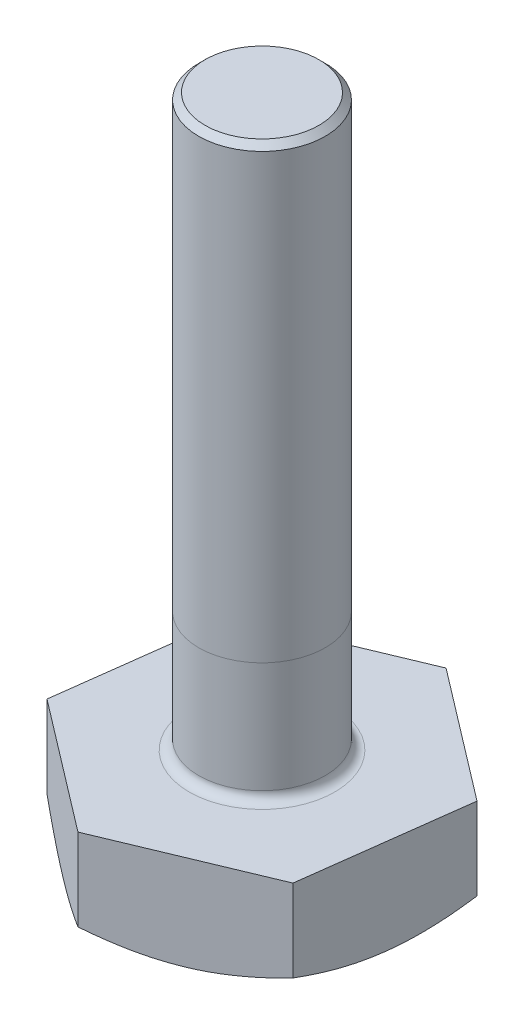
ISO-10303-21;
HEADER;
FILE_DESCRIPTION(('STEP AP214'),'2;1');
FILE_NAME('part.step','',(''),(''),'','','');
FILE_SCHEMA(('AUTOMOTIVE_DESIGN { 1 0 10303 214 1 1 1 1 }'));
ENDSEC;
DATA;
#1=APPLICATION_CONTEXT('core data for automotive mechanical design processes');
#2=APPLICATION_PROTOCOL_DEFINITION('international standard','automotive_design',2000,#1);
#3=PRODUCT_CONTEXT('',#1,'mechanical');
#4=PRODUCT('Part','Part','',(#3));
#5=PRODUCT_RELATED_PRODUCT_CATEGORY('part','',(#4));
#6=PRODUCT_DEFINITION_FORMATION('','',#4);
#7=PRODUCT_DEFINITION_CONTEXT('part definition',#1,'design');
#8=PRODUCT_DEFINITION('design','',#6,#7);
#9=PRODUCT_DEFINITION_SHAPE('','',#8);
#10=(LENGTH_UNIT() NAMED_UNIT(*) SI_UNIT(.MILLI.,.METRE.));
#11=(NAMED_UNIT(*) PLANE_ANGLE_UNIT() SI_UNIT($,.RADIAN.));
#12=(NAMED_UNIT(*) SI_UNIT($,.STERADIAN.) SOLID_ANGLE_UNIT());
#13=UNCERTAINTY_MEASURE_WITH_UNIT(LENGTH_MEASURE(1.E-05),#10,'distance_accuracy_value','');
#14=(GEOMETRIC_REPRESENTATION_CONTEXT(3) GLOBAL_UNCERTAINTY_ASSIGNED_CONTEXT((#13)) GLOBAL_UNIT_ASSIGNED_CONTEXT((#10,
#11,#12)) REPRESENTATION_CONTEXT('',''));
#15=CARTESIAN_POINT('',(0.,0.,0.));
#16=DIRECTION('',(0.,0.,1.));
#17=DIRECTION('',(1.,0.,0.));
#18=AXIS2_PLACEMENT_3D('',#15,#16,#17);
#19=CARTESIAN_POINT('',(0.,10.5,0.));
#20=DIRECTION('',(0.,-1.,0.));
#21=DIRECTION('',(0.,0.,-1.));
#22=AXIS2_PLACEMENT_3D('',#19,#20,#21);
#23=CYLINDRICAL_SURFACE('',#22,1.);
#24=CARTESIAN_POINT('',(0.,1.65,0.));
#25=DIRECTION('',(0.,1.,0.));
#26=DIRECTION('',(0.,0.,1.));
#27=AXIS2_PLACEMENT_3D('',#24,#25,#26);
#28=CIRCLE('',#27,1.);
#29=CARTESIAN_POINT('',(0.,1.65,1.));
#30=VERTEX_POINT('',#29);
#31=EDGE_CURVE('E247',#30,#30,#28,.T.);
#32=ORIENTED_EDGE('',*,*,#31,.T.);
#33=EDGE_LOOP('',(#32));
#34=FACE_BOUND('',#33,.T.);
#35=CARTESIAN_POINT('',(0.,3.4,0.));
#36=DIRECTION('',(0.,1.,0.));
#37=DIRECTION('',(0.,0.,1.));
#38=AXIS2_PLACEMENT_3D('',#35,#36,#37);
#39=CIRCLE('',#38,1.);
#40=CARTESIAN_POINT('',(0.,3.4,1.));
#41=VERTEX_POINT('',#40);
#42=EDGE_CURVE('E12',#41,#41,#39,.T.);
#43=ORIENTED_EDGE('',*,*,#42,.F.);
#44=EDGE_LOOP('',(#43));
#45=FACE_BOUND('',#44,.T.);
#46=ADVANCED_FACE('F48',(#34,#45),#23,.T.);
#47=CARTESIAN_POINT('',(-0.332232258852074,1.5,2.57674634494318));
#48=DIRECTION('',(-0.385150979011419,0.,-0.922853576341635));
#49=DIRECTION('',(-0.922853576341635,0.,0.385150979011419));
#50=AXIS2_PLACEMENT_3D('',#47,#48,#49);
#51=PLANE('',#50);
#52=DIRECTION('',(0.,-1.,0.));
#53=VECTOR('',#52,1.);
#54=CARTESIAN_POINT('',(-0.332232258852074,1.5,2.57674634494318));
#55=LINE('',#54,#53);
#56=CARTESIAN_POINT('',(-0.332232258852074,1.5,2.57674634494318));
#57=VERTEX_POINT('',#56);
#58=CARTESIAN_POINT('',(-0.332232258852074,0.200961894323341,2.57674634494318));
#59=VERTEX_POINT('',#58);
#60=EDGE_CURVE('E149',#57,#59,#55,.T.);
#61=ORIENTED_EDGE('',*,*,#60,.T.);
#62=CARTESIAN_POINT('',(-0.332432258852074,0.201024459653566,2.57682981451818));
#63=CARTESIAN_POINT('',(-0.227066953789804,0.168051809447691,2.53285582835296));
#64=CARTESIAN_POINT('',(-0.120792144366553,0.138064124959722,2.48850226247539));
#65=CARTESIAN_POINT('',(0.0935978268339398,0.085719721103128,2.39902706357609));
#66=CARTESIAN_POINT('',(0.201716798704155,0.0633815202951779,2.35390384042015));
#67=CARTESIAN_POINT('',(0.41661477686134,0.0286080358194854,2.264216625897));
#68=CARTESIAN_POINT('',(0.523360713858126,0.0159413301410296,2.21966643592776));
#69=CARTESIAN_POINT('',(0.737354997418561,0.000818494644419344,2.1303563764242));
#70=CARTESIAN_POINT('',(0.844602565900256,-0.00165015668122193,2.08559683162072));
#71=CARTESIAN_POINT('',(1.04500950337042,0.00347887303042715,2.00195742213465));
#72=CARTESIAN_POINT('',(1.13819883578204,0.0098172012998918,1.9630650522811));
#73=CARTESIAN_POINT('',(1.32397035766778,0.029908038991483,1.88553370238877));
#74=CARTESIAN_POINT('',(1.4165519043443,0.0436674149238157,1.8468949906202));
#75=CARTESIAN_POINT('',(1.60270661351233,0.0780655997506447,1.76920371832988));
#76=CARTESIAN_POINT('',(1.69625620888231,0.0988502565884884,1.73016099349622));
#77=CARTESIAN_POINT('',(1.88195993472118,0.146023564818411,1.65265793813998));
#78=CARTESIAN_POINT('',(1.9741164452953,0.172401128350987,1.61419661428554));
#79=CARTESIAN_POINT('',(2.06561166440346,0.201024459653566,1.57601127901918));
#80=B_SPLINE_CURVE_WITH_KNOTS('',3,(#62,#63,#64,#65,#66,#67,#68,#69,#70,#71,#72,#73,#74,#75,#76,
#77,#78,#79),.UNSPECIFIED.,.F.,.F.,(4,2,2,2,2,2,2,2,4),(0.,0.35665785221363,0.714173128950851,
1.06283956301724,1.41107776546161,1.71432392698712,2.01785115718869,2.32811212607773,
2.63776366375553),.UNSPECIFIED.);
#81=CARTESIAN_POINT('',(0.866589702775693,0.,2.07642054676868));
#82=VERTEX_POINT('',#81);
#83=EDGE_CURVE('E71',#59,#82,#80,.T.);
#84=ORIENTED_EDGE('',*,*,#83,.T.);
#85=CARTESIAN_POINT('',(2.06541166440346,0.200961894323341,1.57609474859417));
#86=VERTEX_POINT('',#85);
#87=EDGE_CURVE('E121',#82,#86,#80,.T.);
#88=ORIENTED_EDGE('',*,*,#87,.T.);
#89=DIRECTION('',(0.,-1.,0.));
#90=VECTOR('',#89,1.);
#91=CARTESIAN_POINT('',(2.06541166440346,1.5,1.57609474859417));
#92=LINE('',#91,#90);
#93=CARTESIAN_POINT('',(2.06541166440346,1.5,1.57609474859417));
#94=VERTEX_POINT('',#93);
#95=EDGE_CURVE('E139',#94,#86,#92,.T.);
#96=ORIENTED_EDGE('',*,*,#95,.F.);
#97=DIRECTION('',(0.922853576341635,0.,-0.385150979011419));
#98=VECTOR('',#97,1.);
#99=CARTESIAN_POINT('',(-0.332232258852074,1.5,2.57674634494318));
#100=LINE('',#99,#98);
#101=EDGE_CURVE('E150',#57,#94,#100,.T.);
#102=ORIENTED_EDGE('',*,*,#101,.F.);
#103=EDGE_LOOP('',(#61,#84,#88,#96,#102));
#104=FACE_BOUND('',#103,.T.);
#105=ADVANCED_FACE('F146',(#104),#51,.F.);
#106=CARTESIAN_POINT('',(2.06541166440346,1.5,1.57609474859417));
#107=DIRECTION('',(-0.991790130590887,0.,-0.127876256054482));
#108=DIRECTION('',(-0.127876256054482,0.,0.991790130590887));
#109=AXIS2_PLACEMENT_3D('',#106,#107,#108);
#110=PLANE('',#109);
#111=ORIENTED_EDGE('',*,*,#95,.T.);
#112=CARTESIAN_POINT('',(2.06538587744468,0.201020110659573,1.57629474859417));
#113=CARTESIAN_POINT('',(2.0799859083404,0.168047817611216,1.46305897679835));
#114=CARTESIAN_POINT('',(2.09471196553429,0.138060512486651,1.34884576288321));
#115=CARTESIAN_POINT('',(2.12441908722442,0.0857168959980417,1.11844153453305));
#116=CARTESIAN_POINT('',(2.13940067964969,0.0633791026995994,1.00224642555533));
#117=CARTESIAN_POINT('',(2.16917819206641,0.0286064238410361,0.771296256699344));
#118=CARTESIAN_POINT('',(2.18396952991726,0.0159401187280296,0.656576735254655));
#119=CARTESIAN_POINT('',(2.21362181858982,0.000818057453612167,0.426597784022752));
#120=CARTESIAN_POINT('',(2.22848266160373,-0.00165021988762785,0.311339190377531));
#121=CARTESIAN_POINT('',(2.25625195139692,0.00347940097462444,0.0959645117610628));
#122=CARTESIAN_POINT('',(2.26916455109488,0.0098178016770352,-0.00418378265917525));
#123=CARTESIAN_POINT('',(2.29490562333471,0.0299084434151819,-0.203827893192223));
#124=CARTESIAN_POINT('',(2.30773400681574,0.0436675501823093,-0.303323018561698));
#125=CARTESIAN_POINT('',(2.33352817003368,0.0780648947201911,-0.50337889520155));
#126=CARTESIAN_POINT('',(2.34649068441782,0.0988489696196559,-0.603914320858312));
#127=CARTESIAN_POINT('',(2.37222235890618,0.146020892845238,-0.803485543761951));
#128=CARTESIAN_POINT('',(2.38499184877747,0.172397654410755,-0.902523898635545));
#129=CARTESIAN_POINT('',(2.39766971021431,0.201020110659574,-1.00085159634901));
#130=B_SPLINE_CURVE_WITH_KNOTS('',3,(#112,#113,#114,#115,#116,#117,#118,#119,#120,#121,#122,
#123,#124,#125,#126,#127,#128,#129),.UNSPECIFIED.,.F.,.F.,(4,2,2,2,2,2,2,2,4),(0.,
0.356656820725204,0.714171037726746,1.06283653886088,1.41107381963043,1.71431331505198,
2.01783385400921,2.32808777751734,2.63773231979533),.UNSPECIFIED.);
#131=CARTESIAN_POINT('',(2.2315277938295,0.,0.287721576122584));
#132=VERTEX_POINT('',#131);
#133=EDGE_CURVE('E127',#86,#132,#130,.T.);
#134=ORIENTED_EDGE('',*,*,#133,.T.);
#135=CARTESIAN_POINT('',(2.39764392325553,0.200961894323341,-1.00065159634901));
#136=VERTEX_POINT('',#135);
#137=EDGE_CURVE('E161',#132,#136,#130,.T.);
#138=ORIENTED_EDGE('',*,*,#137,.T.);
#139=DIRECTION('',(0.,-1.,0.));
#140=VECTOR('',#139,1.);
#141=CARTESIAN_POINT('',(2.39764392325553,1.5,-1.00065159634901));
#142=LINE('',#141,#140);
#143=CARTESIAN_POINT('',(2.39764392325553,1.5,-1.00065159634901));
#144=VERTEX_POINT('',#143);
#145=EDGE_CURVE('E450',#144,#136,#142,.T.);
#146=ORIENTED_EDGE('',*,*,#145,.F.);
#147=DIRECTION('',(0.127876256054482,0.,-0.991790130590887));
#148=VECTOR('',#147,1.);
#149=CARTESIAN_POINT('',(2.06541166440346,1.5,1.57609474859417));
#150=LINE('',#149,#148);
#151=EDGE_CURVE('E152',#94,#144,#150,.T.);
#152=ORIENTED_EDGE('',*,*,#151,.F.);
#153=EDGE_LOOP('',(#111,#134,#138,#146,#152));
#154=FACE_BOUND('',#153,.T.);
#155=ADVANCED_FACE('F217',(#154),#110,.F.);
#156=CARTESIAN_POINT('',(2.39764392325553,1.5,-1.00065159634901));
#157=DIRECTION('',(-0.606639151579468,0.,0.794977320287153));
#158=DIRECTION('',(0.794977320287153,0.,0.606639151579468));
#159=AXIS2_PLACEMENT_3D('',#156,#157,#158);
#160=PLANE('',#159);
#161=ORIENTED_EDGE('',*,*,#145,.T.);
#162=CARTESIAN_POINT('',(2.39784392325553,0.201034524344644,-1.00049897837209));
#163=CARTESIAN_POINT('',(2.30707821386113,0.168061047598218,-1.06976137307744));
#164=CARTESIAN_POINT('',(2.21552902361122,0.138072485180657,-1.13962163409839));
#165=CARTESIAN_POINT('',(2.03084525500839,0.0857262591814721,-1.28055194976481));
#166=CARTESIAN_POINT('',(1.93770739421239,0.0633871153062203,-1.35162450920941));
#167=CARTESIAN_POINT('',(1.75258598480971,0.0286117664519501,-1.49288878414328));
#168=CARTESIAN_POINT('',(1.66063092526992,0.0159441337743801,-1.5630587599138));
#169=CARTESIAN_POINT('',(1.47628795628022,0.000819506548772607,-1.70372901484277));
#170=CARTESIAN_POINT('',(1.38390071721179,-0.00165001026503957,-1.77422878243991));
#171=CARTESIAN_POINT('',(1.21125871114276,0.00347765133630935,-1.90597015092432));
#172=CARTESIAN_POINT('',(1.13097814706009,0.0098158119431566,-1.96723143730396));
#173=CARTESIAN_POINT('',(0.970940065411744,0.0299071030722949,-2.08935487855697));
#174=CARTESIAN_POINT('',(0.891183101705069,0.0436671019073803,-2.15021661078612));
#175=CARTESIAN_POINT('',(0.730814846050216,0.0780672313629739,-2.27259200448364));
#176=CARTESIAN_POINT('',(0.650223859247942,0.0988532349564222,-2.33409017130056));
#177=CARTESIAN_POINT('',(0.490244128832058,0.146029748447324,-2.45616908531832));
#178=CARTESIAN_POINT('',(0.410853334412788,0.17240916794188,-2.51675139746822));
#179=CARTESIAN_POINT('',(0.332032258852074,0.201034524344644,-2.5768989629201));
#180=B_SPLINE_CURVE_WITH_KNOTS('',3,(#162,#163,#164,#165,#166,#167,#168,#169,#170,#171,#172,
#173,#174,#175,#176,#177,#178,#179),.UNSPECIFIED.,.F.,.F.,(4,2,2,2,2,2,2,2,4),(0.,
0.356660239341133,0.714177968577213,1.06284656168946,1.41108689712676,1.71434848547609,
2.01789120068699,2.32816847417637,2.63783620077742),.UNSPECIFIED.);
#181=CARTESIAN_POINT('',(1.3649380910538,0.,-1.78869897064609));
#182=VERTEX_POINT('',#181);
#183=EDGE_CURVE('E211',#136,#182,#180,.T.);
#184=ORIENTED_EDGE('',*,*,#183,.T.);
#185=CARTESIAN_POINT('',(0.332232258852074,0.200961894323341,-2.57674634494318));
#186=VERTEX_POINT('',#185);
#187=EDGE_CURVE('E204',#182,#186,#180,.T.);
#188=ORIENTED_EDGE('',*,*,#187,.T.);
#189=DIRECTION('',(0.,-1.,0.));
#190=VECTOR('',#189,1.);
#191=CARTESIAN_POINT('',(0.332232258852074,1.5,-2.57674634494318));
#192=LINE('',#191,#190);
#193=CARTESIAN_POINT('',(0.332232258852074,1.5,-2.57674634494318));
#194=VERTEX_POINT('',#193);
#195=EDGE_CURVE('E445',#194,#186,#192,.T.);
#196=ORIENTED_EDGE('',*,*,#195,.F.);
#197=DIRECTION('',(-0.794977320287153,0.,-0.606639151579468));
#198=VECTOR('',#197,1.);
#199=CARTESIAN_POINT('',(2.39764392325553,1.5,-1.00065159634901));
#200=LINE('',#199,#198);
#201=EDGE_CURVE('E473',#144,#194,#200,.T.);
#202=ORIENTED_EDGE('',*,*,#201,.F.);
#203=EDGE_LOOP('',(#161,#184,#188,#196,#202));
#204=FACE_BOUND('',#203,.T.);
#205=ADVANCED_FACE('F213',(#204),#160,.F.);
#206=CARTESIAN_POINT('',(0.332232258852074,1.5,-2.57674634494318));
#207=DIRECTION('',(0.385150979011419,0.,0.922853576341635));
#208=DIRECTION('',(0.922853576341635,0.,-0.385150979011419));
#209=AXIS2_PLACEMENT_3D('',#206,#207,#208);
#210=PLANE('',#209);
#211=ORIENTED_EDGE('',*,*,#195,.T.);
#212=CARTESIAN_POINT('',(0.332432258852074,0.201024459653566,-2.57682981451818));
#213=CARTESIAN_POINT('',(0.227066953789804,0.168051809447691,-2.53285582835296));
#214=CARTESIAN_POINT('',(0.120792144366553,0.138064124959722,-2.48850226247539));
#215=CARTESIAN_POINT('',(-0.0935978268339396,0.085719721103128,-2.39902706357609));
#216=CARTESIAN_POINT('',(-0.201716798704155,0.0633815202951778,-2.35390384042015));
#217=CARTESIAN_POINT('',(-0.41661477686134,0.0286080358194854,-2.264216625897));
#218=CARTESIAN_POINT('',(-0.523360713858127,0.0159413301410297,-2.21966643592776));
#219=CARTESIAN_POINT('',(-0.737354997418561,0.000818494644419451,-2.1303563764242));
#220=CARTESIAN_POINT('',(-0.844602565900256,-0.00165015668122179,-2.08559683162072));
#221=CARTESIAN_POINT('',(-1.04500950337042,0.00347887303042715,-2.00195742213465));
#222=CARTESIAN_POINT('',(-1.13819883578204,0.00981720129989165,-1.9630650522811));
#223=CARTESIAN_POINT('',(-1.32397035766777,0.0299080389914829,-1.88553370238877));
#224=CARTESIAN_POINT('',(-1.4165519043443,0.0436674149238158,-1.8468949906202));
#225=CARTESIAN_POINT('',(-1.60270661351233,0.0780655997506449,-1.76920371832988));
#226=CARTESIAN_POINT('',(-1.69625620888231,0.0988502565884884,-1.73016099349622));
#227=CARTESIAN_POINT('',(-1.88195993472118,0.146023564818411,-1.65265793813998));
#228=CARTESIAN_POINT('',(-1.9741164452953,0.172401128350986,-1.61419661428554));
#229=CARTESIAN_POINT('',(-2.06561166440346,0.201024459653566,-1.57601127901918));
#230=B_SPLINE_CURVE_WITH_KNOTS('',3,(#212,#213,#214,#215,#216,#217,#218,#219,#220,#221,#222,
#223,#224,#225,#226,#227,#228,#229),.UNSPECIFIED.,.F.,.F.,(4,2,2,2,2,2,2,2,4),(0.,
0.35665785221363,0.714173128950851,1.06283956301724,1.41107776546161,1.71432392698712,
2.01785115718869,2.32811212607773,2.63776366375553),.UNSPECIFIED.);
#231=CARTESIAN_POINT('',(-0.866589702775693,0.,-2.07642054676868));
#232=VERTEX_POINT('',#231);
#233=EDGE_CURVE('E212',#186,#232,#230,.T.);
#234=ORIENTED_EDGE('',*,*,#233,.T.);
#235=CARTESIAN_POINT('',(-2.06541166440346,0.200961894323341,-1.57609474859417));
#236=VERTEX_POINT('',#235);
#237=EDGE_CURVE('E198',#232,#236,#230,.T.);
#238=ORIENTED_EDGE('',*,*,#237,.T.);
#239=DIRECTION('',(0.,-1.,0.));
#240=VECTOR('',#239,1.);
#241=CARTESIAN_POINT('',(-2.06541166440346,1.5,-1.57609474859417));
#242=LINE('',#241,#240);
#243=CARTESIAN_POINT('',(-2.06541166440346,1.5,-1.57609474859417));
#244=VERTEX_POINT('',#243);
#245=EDGE_CURVE('E451',#244,#236,#242,.T.);
#246=ORIENTED_EDGE('',*,*,#245,.F.);
#247=DIRECTION('',(-0.922853576341635,0.,0.385150979011419));
#248=VECTOR('',#247,1.);
#249=CARTESIAN_POINT('',(0.332232258852074,1.5,-2.57674634494318));
#250=LINE('',#249,#248);
#251=EDGE_CURVE('E448',#194,#244,#250,.T.);
#252=ORIENTED_EDGE('',*,*,#251,.F.);
#253=EDGE_LOOP('',(#211,#234,#238,#246,#252));
#254=FACE_BOUND('',#253,.T.);
#255=ADVANCED_FACE('F216',(#254),#210,.F.);
#256=CARTESIAN_POINT('',(-2.06541166440346,1.5,-1.57609474859417));
#257=DIRECTION('',(0.991790130590887,0.,0.127876256054482));
#258=DIRECTION('',(0.127876256054482,0.,-0.991790130590887));
#259=AXIS2_PLACEMENT_3D('',#256,#257,#258);
#260=PLANE('',#259);
#261=ORIENTED_EDGE('',*,*,#245,.T.);
#262=CARTESIAN_POINT('',(-2.06538587744468,0.201020110659573,-1.57629474859417));
#263=CARTESIAN_POINT('',(-2.0799859083404,0.168047817611216,-1.46305897679835));
#264=CARTESIAN_POINT('',(-2.09471196553429,0.138060512486651,-1.34884576288321));
#265=CARTESIAN_POINT('',(-2.12441908722442,0.0857168959980414,-1.11844153453305));
#266=CARTESIAN_POINT('',(-2.13940067964969,0.0633791026995991,-1.00224642555533));
#267=CARTESIAN_POINT('',(-2.16917819206641,0.0286064238410359,-0.771296256699345));
#268=CARTESIAN_POINT('',(-2.18396952991726,0.0159401187280294,-0.656576735254656));
#269=CARTESIAN_POINT('',(-2.21362181858982,0.000818057453611956,-0.426597784022753));
#270=CARTESIAN_POINT('',(-2.22848266160373,-0.00165021988762805,-0.311339190377532));
#271=CARTESIAN_POINT('',(-2.25625195139692,0.00347940097462427,-0.0959645117610634));
#272=CARTESIAN_POINT('',(-2.26916455109488,0.00981780167703504,0.00418378265917469));
#273=CARTESIAN_POINT('',(-2.29490562333471,0.0299084434151818,0.203827893192223));
#274=CARTESIAN_POINT('',(-2.30773400681574,0.0436675501823092,0.303323018561698));
#275=CARTESIAN_POINT('',(-2.33352817003368,0.078064894720191,0.50337889520155));
#276=CARTESIAN_POINT('',(-2.34649068441782,0.0988489696196558,0.603914320858312));
#277=CARTESIAN_POINT('',(-2.37222235890618,0.146020892845238,0.803485543761951));
#278=CARTESIAN_POINT('',(-2.38499184877747,0.172397654410755,0.902523898635545));
#279=CARTESIAN_POINT('',(-2.39766971021431,0.201020110659574,1.00085159634901));
#280=B_SPLINE_CURVE_WITH_KNOTS('',3,(#262,#263,#264,#265,#266,#267,#268,#269,#270,#271,#272,
#273,#274,#275,#276,#277,#278,#279),.UNSPECIFIED.,.F.,.F.,(4,2,2,2,2,2,2,2,4),(0.,
0.356656820725204,0.714171037726746,1.06283653886088,1.41107381963043,1.71431331505198,
2.01783385400921,2.32808777751734,2.63773231979533),.UNSPECIFIED.);
#281=CARTESIAN_POINT('',(-2.2315277938295,0.,-0.287721576122584));
#282=VERTEX_POINT('',#281);
#283=EDGE_CURVE('E482',#236,#282,#280,.T.);
#284=ORIENTED_EDGE('',*,*,#283,.T.);
#285=CARTESIAN_POINT('',(-2.39764392325553,0.200961894323341,1.00065159634901));
#286=VERTEX_POINT('',#285);
#287=EDGE_CURVE('E191',#282,#286,#280,.T.);
#288=ORIENTED_EDGE('',*,*,#287,.T.);
#289=DIRECTION('',(0.,-1.,0.));
#290=VECTOR('',#289,1.);
#291=CARTESIAN_POINT('',(-2.39764392325553,1.5,1.00065159634901));
#292=LINE('',#291,#290);
#293=CARTESIAN_POINT('',(-2.39764392325553,1.5,1.00065159634901));
#294=VERTEX_POINT('',#293);
#295=EDGE_CURVE('E456',#294,#286,#292,.T.);
#296=ORIENTED_EDGE('',*,*,#295,.F.);
#297=DIRECTION('',(-0.127876256054482,0.,0.991790130590887));
#298=VECTOR('',#297,1.);
#299=CARTESIAN_POINT('',(-2.06541166440346,1.5,-1.57609474859417));
#300=LINE('',#299,#298);
#301=EDGE_CURVE('E465',#244,#294,#300,.T.);
#302=ORIENTED_EDGE('',*,*,#301,.F.);
#303=EDGE_LOOP('',(#261,#284,#288,#296,#302));
#304=FACE_BOUND('',#303,.T.);
#305=ADVANCED_FACE('F349',(#304),#260,.F.);
#306=CARTESIAN_POINT('',(-2.39764392325553,1.5,1.00065159634901));
#307=DIRECTION('',(0.606639151579468,0.,-0.794977320287153));
#308=DIRECTION('',(-0.794977320287153,0.,-0.606639151579468));
#309=AXIS2_PLACEMENT_3D('',#306,#307,#308);
#310=PLANE('',#309);
#311=ORIENTED_EDGE('',*,*,#295,.T.);
#312=CARTESIAN_POINT('',(-2.39784392325553,0.201034524344644,1.00049897837209));
#313=CARTESIAN_POINT('',(-2.30707821386113,0.168061047598218,1.06976137307744));
#314=CARTESIAN_POINT('',(-2.21552902361122,0.138072485180658,1.13962163409839));
#315=CARTESIAN_POINT('',(-2.03084525500839,0.0857262591814722,1.28055194976481));
#316=CARTESIAN_POINT('',(-1.93770739421239,0.0633871153062202,1.35162450920941));
#317=CARTESIAN_POINT('',(-1.75258598480971,0.02861176645195,1.49288878414328));
#318=CARTESIAN_POINT('',(-1.66063092526992,0.0159441337743803,1.5630587599138));
#319=CARTESIAN_POINT('',(-1.47628795628022,0.000819506548772806,1.70372901484277));
#320=CARTESIAN_POINT('',(-1.38390071721179,-0.00165001026503955,1.77422878243991));
#321=CARTESIAN_POINT('',(-1.21125871114276,0.00347765133630933,1.90597015092432));
#322=CARTESIAN_POINT('',(-1.13097814706009,0.00981581194315667,1.96723143730396));
#323=CARTESIAN_POINT('',(-0.970940065411744,0.0299071030722948,2.08935487855696));
#324=CARTESIAN_POINT('',(-0.89118310170507,0.04366710190738,2.15021661078612));
#325=CARTESIAN_POINT('',(-0.730814846050216,0.0780672313629735,2.27259200448364));
#326=CARTESIAN_POINT('',(-0.650223859247943,0.098853234956422,2.33409017130056));
#327=CARTESIAN_POINT('',(-0.490244128832058,0.146029748447324,2.45616908531832));
#328=CARTESIAN_POINT('',(-0.410853334412788,0.17240916794188,2.51675139746822));
#329=CARTESIAN_POINT('',(-0.332032258852074,0.201034524344644,2.5768989629201));
#330=B_SPLINE_CURVE_WITH_KNOTS('',3,(#312,#313,#314,#315,#316,#317,#318,#319,#320,#321,#322,
#323,#324,#325,#326,#327,#328,#329),.UNSPECIFIED.,.F.,.F.,(4,2,2,2,2,2,2,2,4),(0.,
0.356660239341132,0.714177968577213,1.06284656168946,1.41108689712676,1.71434848547609,
2.01789120068699,2.32816847417637,2.63783620077742),.UNSPECIFIED.);
#331=CARTESIAN_POINT('',(-1.3649380910538,0.,1.78869897064609));
#332=VERTEX_POINT('',#331);
#333=EDGE_CURVE('E483',#286,#332,#330,.T.);
#334=ORIENTED_EDGE('',*,*,#333,.T.);
#335=EDGE_CURVE('E135',#332,#59,#330,.T.);
#336=ORIENTED_EDGE('',*,*,#335,.T.);
#337=ORIENTED_EDGE('',*,*,#60,.F.);
#338=DIRECTION('',(0.794977320287153,0.,0.606639151579468));
#339=VECTOR('',#338,1.);
#340=CARTESIAN_POINT('',(-2.39764392325553,1.5,1.00065159634901));
#341=LINE('',#340,#339);
#342=EDGE_CURVE('E463',#294,#57,#341,.T.);
#343=ORIENTED_EDGE('',*,*,#342,.F.);
#344=EDGE_LOOP('',(#311,#334,#336,#337,#343));
#345=FACE_BOUND('',#344,.T.);
#346=ADVANCED_FACE('F344',(#345),#310,.F.);
#347=CARTESIAN_POINT('',(0.,1.5,0.));
#348=DIRECTION('',(0.,1.,0.));
#349=DIRECTION('',(0.,0.,1.));
#350=AXIS2_PLACEMENT_3D('',#347,#348,#349);
#351=PLANE('',#350);
#352=CARTESIAN_POINT('',(0.,1.5,0.));
#353=DIRECTION('',(0.,1.,0.));
#354=DIRECTION('',(0.,0.,1.));
#355=AXIS2_PLACEMENT_3D('',#352,#353,#354);
#356=CIRCLE('',#355,1.15);
#357=CARTESIAN_POINT('',(0.,1.5,1.15));
#358=VERTEX_POINT('',#357);
#359=EDGE_CURVE('E57',#358,#358,#356,.F.);
#360=ORIENTED_EDGE('',*,*,#359,.T.);
#361=EDGE_LOOP('',(#360));
#362=FACE_BOUND('',#361,.T.);
#363=ORIENTED_EDGE('',*,*,#101,.T.);
#364=ORIENTED_EDGE('',*,*,#151,.T.);
#365=ORIENTED_EDGE('',*,*,#201,.T.);
#366=ORIENTED_EDGE('',*,*,#251,.T.);
#367=ORIENTED_EDGE('',*,*,#301,.T.);
#368=ORIENTED_EDGE('',*,*,#342,.T.);
#369=EDGE_LOOP('',(#363,#364,#365,#366,#367,#368));
#370=FACE_BOUND('',#369,.T.);
#371=ADVANCED_FACE('F174',(#362,#370),#351,.T.);
#372=CARTESIAN_POINT('',(0.,0.,0.));
#373=DIRECTION('',(0.,1.,0.));
#374=DIRECTION('',(0.,0.,1.));
#375=AXIS2_PLACEMENT_3D('',#372,#373,#374);
#376=CONICAL_SURFACE('',#375,2.25,1.0471975511966);
#377=ORIENTED_EDGE('',*,*,#335,.F.);
#378=CARTESIAN_POINT('',(0.,0.,0.));
#379=DIRECTION('',(0.,1.,0.));
#380=DIRECTION('',(0.,0.,1.));
#381=AXIS2_PLACEMENT_3D('',#378,#379,#380);
#382=CIRCLE('',#381,2.25);
#383=EDGE_CURVE('E133',#82,#332,#382,.F.);
#384=ORIENTED_EDGE('',*,*,#383,.F.);
#385=ORIENTED_EDGE('',*,*,#83,.F.);
#386=EDGE_LOOP('',(#377,#384,#385));
#387=FACE_BOUND('',#386,.T.);
#388=ADVANCED_FACE('F134',(#387),#376,.T.);
#389=CARTESIAN_POINT('',(0.,0.,0.));
#390=DIRECTION('',(0.,1.,0.));
#391=DIRECTION('',(0.,0.,1.));
#392=AXIS2_PLACEMENT_3D('',#389,#390,#391);
#393=CIRCLE('',#392,2.25);
#394=EDGE_CURVE('E124',#82,#132,#393,.T.);
#395=ORIENTED_EDGE('',*,*,#394,.T.);
#396=ORIENTED_EDGE('',*,*,#133,.F.);
#397=ORIENTED_EDGE('',*,*,#87,.F.);
#398=EDGE_LOOP('',(#395,#396,#397));
#399=FACE_BOUND('',#398,.T.);
#400=ADVANCED_FACE('F122',(#399),#376,.T.);
#401=EDGE_CURVE('E138',#182,#132,#382,.F.);
#402=ORIENTED_EDGE('',*,*,#401,.F.);
#403=ORIENTED_EDGE('',*,*,#183,.F.);
#404=ORIENTED_EDGE('',*,*,#137,.F.);
#405=EDGE_LOOP('',(#402,#403,#404));
#406=FACE_BOUND('',#405,.T.);
#407=ADVANCED_FACE('F314',(#406),#376,.T.);
#408=EDGE_CURVE('E475',#232,#182,#382,.F.);
#409=ORIENTED_EDGE('',*,*,#408,.F.);
#410=ORIENTED_EDGE('',*,*,#233,.F.);
#411=ORIENTED_EDGE('',*,*,#187,.F.);
#412=EDGE_LOOP('',(#409,#410,#411));
#413=FACE_BOUND('',#412,.T.);
#414=ADVANCED_FACE('F304',(#413),#376,.T.);
#415=EDGE_CURVE('E479',#282,#232,#382,.F.);
#416=ORIENTED_EDGE('',*,*,#415,.F.);
#417=ORIENTED_EDGE('',*,*,#283,.F.);
#418=ORIENTED_EDGE('',*,*,#237,.F.);
#419=EDGE_LOOP('',(#416,#417,#418));
#420=FACE_BOUND('',#419,.T.);
#421=ADVANCED_FACE('F295',(#420),#376,.T.);
#422=EDGE_CURVE('E64',#332,#282,#382,.F.);
#423=ORIENTED_EDGE('',*,*,#422,.F.);
#424=ORIENTED_EDGE('',*,*,#333,.F.);
#425=ORIENTED_EDGE('',*,*,#287,.F.);
#426=EDGE_LOOP('',(#423,#424,#425));
#427=FACE_BOUND('',#426,.T.);
#428=ADVANCED_FACE('F175',(#427),#376,.T.);
#429=CARTESIAN_POINT('',(0.,0.,0.));
#430=DIRECTION('',(0.,1.,0.));
#431=DIRECTION('',(0.,0.,1.));
#432=AXIS2_PLACEMENT_3D('',#429,#430,#431);
#433=PLANE('',#432);
#434=ORIENTED_EDGE('',*,*,#383,.T.);
#435=ORIENTED_EDGE('',*,*,#422,.T.);
#436=ORIENTED_EDGE('',*,*,#415,.T.);
#437=ORIENTED_EDGE('',*,*,#408,.T.);
#438=ORIENTED_EDGE('',*,*,#401,.T.);
#439=ORIENTED_EDGE('',*,*,#394,.F.);
#440=EDGE_LOOP('',(#434,#435,#436,#437,#438,#439));
#441=FACE_BOUND('',#440,.T.);
#442=ADVANCED_FACE('F141',(#441),#433,.F.);
#443=ORIENTED_EDGE('',*,*,#42,.T.);
#444=EDGE_LOOP('',(#443));
#445=FACE_BOUND('',#444,.T.);
#446=CARTESIAN_POINT('',(0.,10.4,0.));
#447=DIRECTION('',(0.,1.,0.));
#448=DIRECTION('',(0.,0.,1.));
#449=AXIS2_PLACEMENT_3D('',#446,#447,#448);
#450=CIRCLE('',#449,1.);
#451=CARTESIAN_POINT('',(0.,10.4,1.));
#452=VERTEX_POINT('',#451);
#453=EDGE_CURVE('E245',#452,#452,#450,.F.);
#454=ORIENTED_EDGE('',*,*,#453,.T.);
#455=EDGE_LOOP('',(#454));
#456=FACE_BOUND('',#455,.T.);
#457=ADVANCED_FACE('F176',(#445,#456),#23,.T.);
#458=CARTESIAN_POINT('',(0.,10.5,0.));
#459=DIRECTION('',(0.,1.,0.));
#460=DIRECTION('',(0.,0.,1.));
#461=AXIS2_PLACEMENT_3D('',#458,#459,#460);
#462=PLANE('',#461);
#463=CARTESIAN_POINT('',(0.,10.5,0.));
#464=DIRECTION('',(0.,1.,0.));
#465=DIRECTION('',(0.,0.,1.));
#466=AXIS2_PLACEMENT_3D('',#463,#464,#465);
#467=CIRCLE('',#466,0.900000000000001);
#468=CARTESIAN_POINT('',(0.,10.5,0.900000000000001));
#469=VERTEX_POINT('',#468);
#470=EDGE_CURVE('E248',#469,#469,#467,.T.);
#471=ORIENTED_EDGE('',*,*,#470,.T.);
#472=EDGE_LOOP('',(#471));
#473=FACE_BOUND('',#472,.T.);
#474=ADVANCED_FACE('F233',(#473),#462,.T.);
#475=CARTESIAN_POINT('',(0.,10.5,0.));
#476=DIRECTION('',(0.,-1.,0.));
#477=DIRECTION('',(0.,0.,-1.));
#478=AXIS2_PLACEMENT_3D('',#475,#476,#477);
#479=CONICAL_SURFACE('',#478,0.900000000000001,0.785398163397444);
#480=ORIENTED_EDGE('',*,*,#453,.F.);
#481=EDGE_LOOP('',(#480));
#482=FACE_BOUND('',#481,.T.);
#483=ORIENTED_EDGE('',*,*,#470,.F.);
#484=EDGE_LOOP('',(#483));
#485=FACE_BOUND('',#484,.T.);
#486=ADVANCED_FACE('F239',(#482,#485),#479,.T.);
#487=CARTESIAN_POINT('',(0.,1.65,0.));
#488=DIRECTION('',(0.,1.,0.));
#489=DIRECTION('',(0.,0.,1.));
#490=AXIS2_PLACEMENT_3D('',#487,#488,#489);
#491=TOROIDAL_SURFACE('',#490,1.15,0.15);
#492=ORIENTED_EDGE('',*,*,#359,.F.);
#493=EDGE_LOOP('',(#492));
#494=FACE_BOUND('',#493,.T.);
#495=ORIENTED_EDGE('',*,*,#31,.F.);
#496=EDGE_LOOP('',(#495));
#497=FACE_BOUND('',#496,.T.);
#498=ADVANCED_FACE('F50',(#494,#497),#491,.F.);
#499=CLOSED_SHELL('',(#46,#105,#155,#205,#255,#305,#346,#371,#388,#400,#407,#414,#421,#428,#442,
#457,#474,#486,#498));
#500=MANIFOLD_SOLID_BREP('B2',#499);
#501=ADVANCED_BREP_SHAPE_REPRESENTATION('',(#18,#500),#14);
#502=SHAPE_DEFINITION_REPRESENTATION(#9,#501);
ENDSEC;
END-ISO-10303-21;
